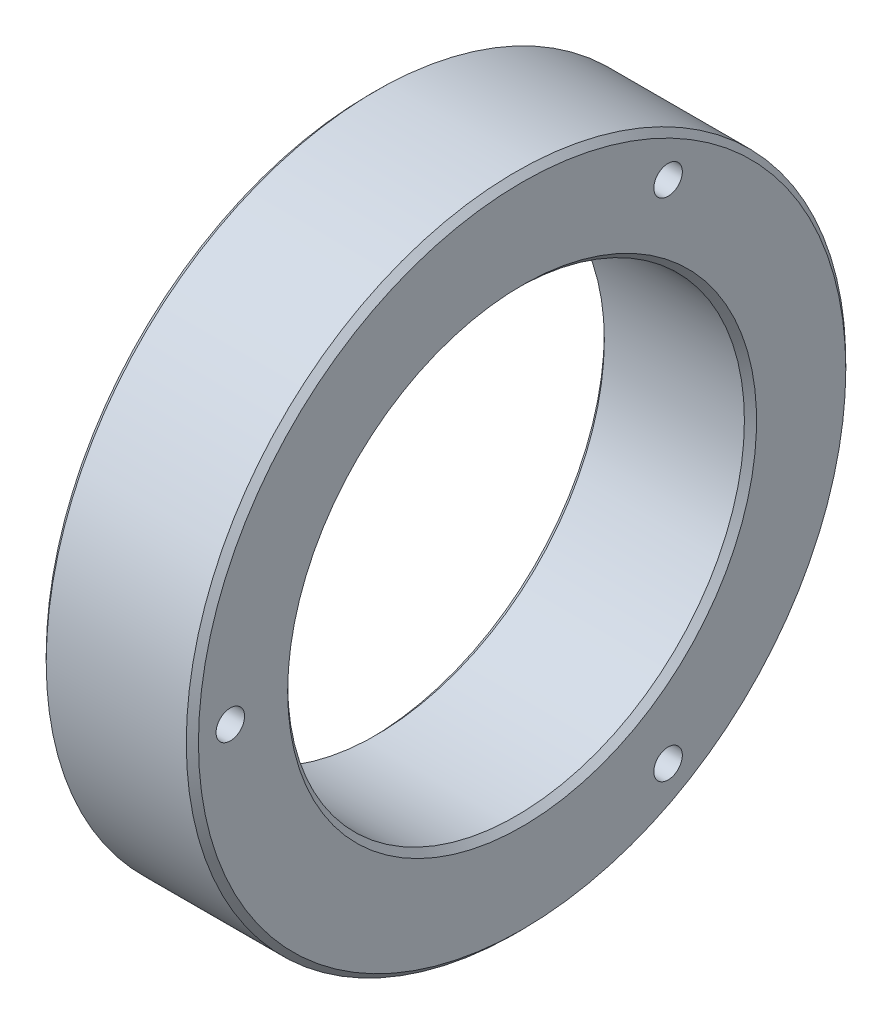
ISO-10303-21;
HEADER;
FILE_DESCRIPTION(('STEP AP214'),'2;1');
FILE_NAME('part.step','',(''),(''),'','','');
FILE_SCHEMA(('AUTOMOTIVE_DESIGN { 1 0 10303 214 1 1 1 1 }'));
ENDSEC;
DATA;
#1=APPLICATION_CONTEXT('core data for automotive mechanical design processes');
#2=APPLICATION_PROTOCOL_DEFINITION('international standard','automotive_design',2000,#1);
#3=PRODUCT_CONTEXT('',#1,'mechanical');
#4=PRODUCT('Part','Part','',(#3));
#5=PRODUCT_RELATED_PRODUCT_CATEGORY('part','',(#4));
#6=PRODUCT_DEFINITION_FORMATION('','',#4);
#7=PRODUCT_DEFINITION_CONTEXT('part definition',#1,'design');
#8=PRODUCT_DEFINITION('design','',#6,#7);
#9=PRODUCT_DEFINITION_SHAPE('','',#8);
#10=(LENGTH_UNIT() NAMED_UNIT(*) SI_UNIT(.MILLI.,.METRE.));
#11=(NAMED_UNIT(*) PLANE_ANGLE_UNIT() SI_UNIT($,.RADIAN.));
#12=(NAMED_UNIT(*) SI_UNIT($,.STERADIAN.) SOLID_ANGLE_UNIT());
#13=UNCERTAINTY_MEASURE_WITH_UNIT(LENGTH_MEASURE(1.E-05),#10,'distance_accuracy_value','');
#14=(GEOMETRIC_REPRESENTATION_CONTEXT(3) GLOBAL_UNCERTAINTY_ASSIGNED_CONTEXT((#13)) GLOBAL_UNIT_ASSIGNED_CONTEXT((#10,
#11,#12)) REPRESENTATION_CONTEXT('',''));
#15=CARTESIAN_POINT('',(0.,0.,0.));
#16=DIRECTION('',(0.,0.,1.));
#17=DIRECTION('',(1.,0.,0.));
#18=AXIS2_PLACEMENT_3D('',#15,#16,#17);
#19=CARTESIAN_POINT('',(0.,57.15,0.));
#20=DIRECTION('',(1.,0.,0.));
#21=DIRECTION('',(0.,0.,-1.));
#22=AXIS2_PLACEMENT_3D('',#19,#20,#21);
#23=PLANE('',#22);
#24=CARTESIAN_POINT('',(0.,69.85,0.));
#25=DIRECTION('',(1.,0.,0.));
#26=DIRECTION('',(0.,0.,-1.));
#27=AXIS2_PLACEMENT_3D('',#24,#25,#26);
#28=CIRCLE('',#27,3.96874999999999);
#29=CARTESIAN_POINT('',(0.,69.85,-3.96874999999999));
#30=VERTEX_POINT('',#29);
#31=EDGE_CURVE('E225',#30,#30,#28,.T.);
#32=ORIENTED_EDGE('',*,*,#31,.T.);
#33=EDGE_LOOP('',(#32));
#34=FACE_BOUND('',#33,.T.);
#35=CARTESIAN_POINT('',(0.,-69.85,0.));
#36=DIRECTION('',(1.,0.,0.));
#37=DIRECTION('',(0.,0.,-1.));
#38=AXIS2_PLACEMENT_3D('',#35,#36,#37);
#39=CIRCLE('',#38,3.96874999999999);
#40=CARTESIAN_POINT('',(0.,-69.85,-3.96874999999999));
#41=VERTEX_POINT('',#40);
#42=EDGE_CURVE('E224',#41,#41,#39,.T.);
#43=ORIENTED_EDGE('',*,*,#42,.T.);
#44=EDGE_LOOP('',(#43));
#45=FACE_BOUND('',#44,.T.);
#46=CARTESIAN_POINT('',(0.,63.246,-36.5252));
#47=DIRECTION('',(1.,0.,0.));
#48=DIRECTION('',(0.,0.,-1.));
#49=AXIS2_PLACEMENT_3D('',#46,#47,#48);
#50=CIRCLE('',#49,5.5626);
#51=CARTESIAN_POINT('',(0.,63.246,-42.0878));
#52=VERTEX_POINT('',#51);
#53=EDGE_CURVE('E233',#52,#52,#50,.T.);
#54=ORIENTED_EDGE('',*,*,#53,.T.);
#55=EDGE_LOOP('',(#54));
#56=FACE_BOUND('',#55,.T.);
#57=CARTESIAN_POINT('',(0.,-63.246,-36.5252));
#58=DIRECTION('',(1.,0.,0.));
#59=DIRECTION('',(0.,0.,-1.));
#60=AXIS2_PLACEMENT_3D('',#57,#58,#59);
#61=CIRCLE('',#60,5.5626);
#62=CARTESIAN_POINT('',(0.,-63.246,-42.0878));
#63=VERTEX_POINT('',#62);
#64=EDGE_CURVE('E75',#63,#63,#61,.T.);
#65=ORIENTED_EDGE('',*,*,#64,.T.);
#66=EDGE_LOOP('',(#65));
#67=FACE_BOUND('',#66,.T.);
#68=CARTESIAN_POINT('',(0.,0.,73.025));
#69=DIRECTION('',(1.,0.,0.));
#70=DIRECTION('',(0.,0.,-1.));
#71=AXIS2_PLACEMENT_3D('',#68,#69,#70);
#72=CIRCLE('',#71,5.5626);
#73=CARTESIAN_POINT('',(0.,0.,67.4624));
#74=VERTEX_POINT('',#73);
#75=EDGE_CURVE('E72',#74,#74,#72,.T.);
#76=ORIENTED_EDGE('',*,*,#75,.T.);
#77=EDGE_LOOP('',(#76));
#78=FACE_BOUND('',#77,.T.);
#79=CARTESIAN_POINT('',(0.,0.,0.));
#80=DIRECTION('',(1.,0.,0.));
#81=DIRECTION('',(0.,0.,-1.));
#82=AXIS2_PLACEMENT_3D('',#79,#80,#81);
#83=CIRCLE('',#82,58.674);
#84=CARTESIAN_POINT('',(0.,0.,-58.674));
#85=VERTEX_POINT('',#84);
#86=EDGE_CURVE('E57',#85,#85,#83,.T.);
#87=ORIENTED_EDGE('',*,*,#86,.T.);
#88=EDGE_LOOP('',(#87));
#89=FACE_BOUND('',#88,.T.);
#90=CARTESIAN_POINT('',(0.,0.,0.));
#91=DIRECTION('',(1.,0.,0.));
#92=DIRECTION('',(0.,0.,-1.));
#93=AXIS2_PLACEMENT_3D('',#90,#91,#92);
#94=CIRCLE('',#93,81.0006);
#95=CARTESIAN_POINT('',(0.,0.,-81.0006));
#96=VERTEX_POINT('',#95);
#97=EDGE_CURVE('E103',#96,#96,#94,.F.);
#98=ORIENTED_EDGE('',*,*,#97,.T.);
#99=EDGE_LOOP('',(#98));
#100=FACE_BOUND('',#99,.T.);
#101=ADVANCED_FACE('F43',(#34,#45,#56,#67,#78,#89,#100),#23,.F.);
#102=CARTESIAN_POINT('',(-25.4,0.,0.));
#103=DIRECTION('',(-1.,0.,0.));
#104=DIRECTION('',(0.,0.,1.));
#105=AXIS2_PLACEMENT_3D('',#102,#103,#104);
#106=CYLINDRICAL_SURFACE('',#105,82.5246);
#107=CARTESIAN_POINT('',(36.576,0.,0.));
#108=DIRECTION('',(-1.,0.,0.));
#109=DIRECTION('',(0.,0.,1.));
#110=AXIS2_PLACEMENT_3D('',#107,#108,#109);
#111=CIRCLE('',#110,82.5246);
#112=CARTESIAN_POINT('',(36.576,0.,82.5246));
#113=VERTEX_POINT('',#112);
#114=EDGE_CURVE('E10',#113,#113,#111,.T.);
#115=ORIENTED_EDGE('',*,*,#114,.T.);
#116=EDGE_LOOP('',(#115));
#117=FACE_BOUND('',#116,.T.);
#118=CARTESIAN_POINT('',(1.524,0.,0.));
#119=DIRECTION('',(1.,0.,0.));
#120=DIRECTION('',(0.,0.,-1.));
#121=AXIS2_PLACEMENT_3D('',#118,#119,#120);
#122=CIRCLE('',#121,82.5246);
#123=CARTESIAN_POINT('',(1.524,0.,-82.5246));
#124=VERTEX_POINT('',#123);
#125=EDGE_CURVE('E52',#124,#124,#122,.T.);
#126=ORIENTED_EDGE('',*,*,#125,.T.);
#127=EDGE_LOOP('',(#126));
#128=FACE_BOUND('',#127,.T.);
#129=ADVANCED_FACE('F130',(#117,#128),#106,.T.);
#130=CARTESIAN_POINT('',(38.1,82.5246,0.));
#131=DIRECTION('',(-1.,0.,0.));
#132=DIRECTION('',(0.,0.,1.));
#133=AXIS2_PLACEMENT_3D('',#130,#131,#132);
#134=PLANE('',#133);
#135=CARTESIAN_POINT('',(38.1,63.246,-36.5252));
#136=DIRECTION('',(1.,0.,0.));
#137=DIRECTION('',(0.,0.,-1.));
#138=AXIS2_PLACEMENT_3D('',#135,#136,#137);
#139=CIRCLE('',#138,3.5687);
#140=CARTESIAN_POINT('',(38.1,63.246,-40.0939));
#141=VERTEX_POINT('',#140);
#142=EDGE_CURVE('E80',#141,#141,#139,.T.);
#143=ORIENTED_EDGE('',*,*,#142,.F.);
#144=EDGE_LOOP('',(#143));
#145=FACE_BOUND('',#144,.T.);
#146=CARTESIAN_POINT('',(38.1,-63.246,-36.5252));
#147=DIRECTION('',(1.,0.,0.));
#148=DIRECTION('',(0.,0.,-1.));
#149=AXIS2_PLACEMENT_3D('',#146,#147,#148);
#150=CIRCLE('',#149,3.5687);
#151=CARTESIAN_POINT('',(38.1,-63.246,-40.0939));
#152=VERTEX_POINT('',#151);
#153=EDGE_CURVE('E67',#152,#152,#150,.T.);
#154=ORIENTED_EDGE('',*,*,#153,.F.);
#155=EDGE_LOOP('',(#154));
#156=FACE_BOUND('',#155,.T.);
#157=CARTESIAN_POINT('',(38.1,0.,73.025));
#158=DIRECTION('',(1.,0.,0.));
#159=DIRECTION('',(0.,0.,-1.));
#160=AXIS2_PLACEMENT_3D('',#157,#158,#159);
#161=CIRCLE('',#160,3.5687);
#162=CARTESIAN_POINT('',(38.1,0.,69.4563));
#163=VERTEX_POINT('',#162);
#164=EDGE_CURVE('E63',#163,#163,#161,.T.);
#165=ORIENTED_EDGE('',*,*,#164,.F.);
#166=EDGE_LOOP('',(#165));
#167=FACE_BOUND('',#166,.T.);
#168=CARTESIAN_POINT('',(38.1,0.,0.));
#169=DIRECTION('',(-1.,0.,0.));
#170=DIRECTION('',(0.,0.,1.));
#171=AXIS2_PLACEMENT_3D('',#168,#169,#170);
#172=CIRCLE('',#171,58.674);
#173=CARTESIAN_POINT('',(38.1,0.,58.674));
#174=VERTEX_POINT('',#173);
#175=EDGE_CURVE('E94',#174,#174,#172,.T.);
#176=ORIENTED_EDGE('',*,*,#175,.T.);
#177=EDGE_LOOP('',(#176));
#178=FACE_BOUND('',#177,.T.);
#179=CARTESIAN_POINT('',(38.1,0.,0.));
#180=DIRECTION('',(-1.,0.,0.));
#181=DIRECTION('',(0.,0.,1.));
#182=AXIS2_PLACEMENT_3D('',#179,#180,#181);
#183=CIRCLE('',#182,81.0006);
#184=CARTESIAN_POINT('',(38.1,0.,81.0006));
#185=VERTEX_POINT('',#184);
#186=EDGE_CURVE('E91',#185,#185,#183,.F.);
#187=ORIENTED_EDGE('',*,*,#186,.T.);
#188=EDGE_LOOP('',(#187));
#189=FACE_BOUND('',#188,.T.);
#190=ADVANCED_FACE('F120',(#145,#156,#167,#178,#189),#134,.F.);
#191=CARTESIAN_POINT('',(-25.4,0.,0.));
#192=DIRECTION('',(-1.,0.,0.));
#193=DIRECTION('',(0.,0.,1.));
#194=AXIS2_PLACEMENT_3D('',#191,#192,#193);
#195=CYLINDRICAL_SURFACE('',#194,57.15);
#196=CARTESIAN_POINT('',(36.576,0.,0.));
#197=DIRECTION('',(-1.,0.,0.));
#198=DIRECTION('',(0.,0.,1.));
#199=AXIS2_PLACEMENT_3D('',#196,#197,#198);
#200=CIRCLE('',#199,57.15);
#201=CARTESIAN_POINT('',(36.576,0.,57.15));
#202=VERTEX_POINT('',#201);
#203=EDGE_CURVE('E100',#202,#202,#200,.F.);
#204=ORIENTED_EDGE('',*,*,#203,.T.);
#205=EDGE_LOOP('',(#204));
#206=FACE_BOUND('',#205,.T.);
#207=CARTESIAN_POINT('',(1.52399999999998,0.,0.));
#208=DIRECTION('',(1.,0.,0.));
#209=DIRECTION('',(0.,0.,-1.));
#210=AXIS2_PLACEMENT_3D('',#207,#208,#209);
#211=CIRCLE('',#210,57.15);
#212=CARTESIAN_POINT('',(1.52399999999998,0.,-57.15));
#213=VERTEX_POINT('',#212);
#214=EDGE_CURVE('E97',#213,#213,#211,.F.);
#215=ORIENTED_EDGE('',*,*,#214,.T.);
#216=EDGE_LOOP('',(#215));
#217=FACE_BOUND('',#216,.T.);
#218=ADVANCED_FACE('F118',(#206,#217),#195,.F.);
#219=CARTESIAN_POINT('',(38.1,0.,0.));
#220=DIRECTION('',(1.,0.,0.));
#221=DIRECTION('',(0.,0.,-1.));
#222=AXIS2_PLACEMENT_3D('',#219,#220,#221);
#223=CONICAL_SURFACE('',#222,58.674,0.785398163397444);
#224=ORIENTED_EDGE('',*,*,#203,.F.);
#225=EDGE_LOOP('',(#224));
#226=FACE_BOUND('',#225,.T.);
#227=ORIENTED_EDGE('',*,*,#175,.F.);
#228=EDGE_LOOP('',(#227));
#229=FACE_BOUND('',#228,.T.);
#230=ADVANCED_FACE('F114',(#226,#229),#223,.F.);
#231=CARTESIAN_POINT('',(1.52399999999998,0.,0.));
#232=DIRECTION('',(-1.,0.,0.));
#233=DIRECTION('',(0.,0.,1.));
#234=AXIS2_PLACEMENT_3D('',#231,#232,#233);
#235=CONICAL_SURFACE('',#234,57.15,0.785398163397455);
#236=ORIENTED_EDGE('',*,*,#86,.F.);
#237=EDGE_LOOP('',(#236));
#238=FACE_BOUND('',#237,.T.);
#239=ORIENTED_EDGE('',*,*,#214,.F.);
#240=EDGE_LOOP('',(#239));
#241=FACE_BOUND('',#240,.T.);
#242=ADVANCED_FACE('F110',(#238,#241),#235,.F.);
#243=CARTESIAN_POINT('',(36.576,0.,0.));
#244=DIRECTION('',(-1.,0.,0.));
#245=DIRECTION('',(0.,0.,1.));
#246=AXIS2_PLACEMENT_3D('',#243,#244,#245);
#247=CONICAL_SURFACE('',#246,82.5246,0.785398163397451);
#248=ORIENTED_EDGE('',*,*,#186,.F.);
#249=EDGE_LOOP('',(#248));
#250=FACE_BOUND('',#249,.T.);
#251=ORIENTED_EDGE('',*,*,#114,.F.);
#252=EDGE_LOOP('',(#251));
#253=FACE_BOUND('',#252,.T.);
#254=ADVANCED_FACE('F113',(#250,#253),#247,.T.);
#255=CARTESIAN_POINT('',(0.,0.,0.));
#256=DIRECTION('',(1.,0.,0.));
#257=DIRECTION('',(0.,0.,-1.));
#258=AXIS2_PLACEMENT_3D('',#255,#256,#257);
#259=CONICAL_SURFACE('',#258,81.0006,0.785398163397448);
#260=ORIENTED_EDGE('',*,*,#125,.F.);
#261=EDGE_LOOP('',(#260));
#262=FACE_BOUND('',#261,.T.);
#263=ORIENTED_EDGE('',*,*,#97,.F.);
#264=EDGE_LOOP('',(#263));
#265=FACE_BOUND('',#264,.T.);
#266=ADVANCED_FACE('F46',(#262,#265),#259,.T.);
#267=CARTESIAN_POINT('',(38.1,0.,73.025));
#268=DIRECTION('',(-1.,0.,0.));
#269=DIRECTION('',(0.,0.,1.));
#270=AXIS2_PLACEMENT_3D('',#267,#268,#269);
#271=CYLINDRICAL_SURFACE('',#270,3.5687);
#272=CARTESIAN_POINT('',(7.112,0.,73.025));
#273=DIRECTION('',(1.,0.,0.));
#274=DIRECTION('',(0.,0.,-1.));
#275=AXIS2_PLACEMENT_3D('',#272,#273,#274);
#276=CIRCLE('',#275,3.5687);
#277=CARTESIAN_POINT('',(7.112,0.,69.4563));
#278=VERTEX_POINT('',#277);
#279=EDGE_CURVE('E61',#278,#278,#276,.T.);
#280=ORIENTED_EDGE('',*,*,#279,.F.);
#281=EDGE_LOOP('',(#280));
#282=FACE_BOUND('',#281,.T.);
#283=ORIENTED_EDGE('',*,*,#164,.T.);
#284=EDGE_LOOP('',(#283));
#285=FACE_BOUND('',#284,.T.);
#286=ADVANCED_FACE('F158',(#282,#285),#271,.F.);
#287=CARTESIAN_POINT('',(7.112,0.,73.025));
#288=DIRECTION('',(-1.,0.,0.));
#289=DIRECTION('',(0.,0.,1.));
#290=AXIS2_PLACEMENT_3D('',#287,#288,#289);
#291=CYLINDRICAL_SURFACE('',#290,5.5626);
#292=CARTESIAN_POINT('',(7.112,0.,73.025));
#293=DIRECTION('',(1.,0.,0.));
#294=DIRECTION('',(0.,0.,-1.));
#295=AXIS2_PLACEMENT_3D('',#292,#293,#294);
#296=CIRCLE('',#295,5.5626);
#297=CARTESIAN_POINT('',(7.112,0.,67.4624));
#298=VERTEX_POINT('',#297);
#299=EDGE_CURVE('E64',#298,#298,#296,.T.);
#300=ORIENTED_EDGE('',*,*,#299,.T.);
#301=EDGE_LOOP('',(#300));
#302=FACE_BOUND('',#301,.T.);
#303=ORIENTED_EDGE('',*,*,#75,.F.);
#304=EDGE_LOOP('',(#303));
#305=FACE_BOUND('',#304,.T.);
#306=ADVANCED_FACE('F166',(#302,#305),#291,.F.);
#307=CARTESIAN_POINT('',(7.112,0.,73.025));
#308=DIRECTION('',(1.,0.,0.));
#309=DIRECTION('',(0.,0.,-1.));
#310=AXIS2_PLACEMENT_3D('',#307,#308,#309);
#311=PLANE('',#310);
#312=ORIENTED_EDGE('',*,*,#279,.T.);
#313=EDGE_LOOP('',(#312));
#314=FACE_BOUND('',#313,.T.);
#315=ORIENTED_EDGE('',*,*,#299,.F.);
#316=EDGE_LOOP('',(#315));
#317=FACE_BOUND('',#316,.T.);
#318=ADVANCED_FACE('F175',(#314,#317),#311,.F.);
#319=CARTESIAN_POINT('',(38.1,-63.246,-36.5252));
#320=DIRECTION('',(-1.,0.,0.));
#321=DIRECTION('',(0.,0.,1.));
#322=AXIS2_PLACEMENT_3D('',#319,#320,#321);
#323=CYLINDRICAL_SURFACE('',#322,3.5687);
#324=CARTESIAN_POINT('',(7.112,-63.246,-36.5252));
#325=DIRECTION('',(1.,0.,0.));
#326=DIRECTION('',(0.,0.,-1.));
#327=AXIS2_PLACEMENT_3D('',#324,#325,#326);
#328=CIRCLE('',#327,3.5687);
#329=CARTESIAN_POINT('',(7.112,-63.246,-40.0939));
#330=VERTEX_POINT('',#329);
#331=EDGE_CURVE('E65',#330,#330,#328,.T.);
#332=ORIENTED_EDGE('',*,*,#331,.F.);
#333=EDGE_LOOP('',(#332));
#334=FACE_BOUND('',#333,.T.);
#335=ORIENTED_EDGE('',*,*,#153,.T.);
#336=EDGE_LOOP('',(#335));
#337=FACE_BOUND('',#336,.T.);
#338=ADVANCED_FACE('F183',(#334,#337),#323,.F.);
#339=CARTESIAN_POINT('',(7.112,-63.246,-36.5252));
#340=DIRECTION('',(-1.,0.,0.));
#341=DIRECTION('',(0.,0.,1.));
#342=AXIS2_PLACEMENT_3D('',#339,#340,#341);
#343=CYLINDRICAL_SURFACE('',#342,5.5626);
#344=CARTESIAN_POINT('',(7.112,-63.246,-36.5252));
#345=DIRECTION('',(1.,0.,0.));
#346=DIRECTION('',(0.,0.,-1.));
#347=AXIS2_PLACEMENT_3D('',#344,#345,#346);
#348=CIRCLE('',#347,5.5626);
#349=CARTESIAN_POINT('',(7.112,-63.246,-42.0878));
#350=VERTEX_POINT('',#349);
#351=EDGE_CURVE('E68',#350,#350,#348,.T.);
#352=ORIENTED_EDGE('',*,*,#351,.T.);
#353=EDGE_LOOP('',(#352));
#354=FACE_BOUND('',#353,.T.);
#355=ORIENTED_EDGE('',*,*,#64,.F.);
#356=EDGE_LOOP('',(#355));
#357=FACE_BOUND('',#356,.T.);
#358=ADVANCED_FACE('F187',(#354,#357),#343,.F.);
#359=CARTESIAN_POINT('',(7.112,-63.246,-36.5252));
#360=DIRECTION('',(1.,0.,0.));
#361=DIRECTION('',(0.,0.,-1.));
#362=AXIS2_PLACEMENT_3D('',#359,#360,#361);
#363=PLANE('',#362);
#364=ORIENTED_EDGE('',*,*,#331,.T.);
#365=EDGE_LOOP('',(#364));
#366=FACE_BOUND('',#365,.T.);
#367=ORIENTED_EDGE('',*,*,#351,.F.);
#368=EDGE_LOOP('',(#367));
#369=FACE_BOUND('',#368,.T.);
#370=ADVANCED_FACE('F191',(#366,#369),#363,.F.);
#371=CARTESIAN_POINT('',(38.1,63.246,-36.5252));
#372=DIRECTION('',(-1.,0.,0.));
#373=DIRECTION('',(0.,0.,1.));
#374=AXIS2_PLACEMENT_3D('',#371,#372,#373);
#375=CYLINDRICAL_SURFACE('',#374,3.5687);
#376=CARTESIAN_POINT('',(7.112,63.246,-36.5252));
#377=DIRECTION('',(1.,0.,0.));
#378=DIRECTION('',(0.,0.,-1.));
#379=AXIS2_PLACEMENT_3D('',#376,#377,#378);
#380=CIRCLE('',#379,3.5687);
#381=CARTESIAN_POINT('',(7.112,63.246,-40.0939));
#382=VERTEX_POINT('',#381);
#383=EDGE_CURVE('E48',#382,#382,#380,.T.);
#384=ORIENTED_EDGE('',*,*,#383,.F.);
#385=EDGE_LOOP('',(#384));
#386=FACE_BOUND('',#385,.T.);
#387=ORIENTED_EDGE('',*,*,#142,.T.);
#388=EDGE_LOOP('',(#387));
#389=FACE_BOUND('',#388,.T.);
#390=ADVANCED_FACE('F194',(#386,#389),#375,.F.);
#391=CARTESIAN_POINT('',(7.112,63.246,-36.5252));
#392=DIRECTION('',(-1.,0.,0.));
#393=DIRECTION('',(0.,0.,1.));
#394=AXIS2_PLACEMENT_3D('',#391,#392,#393);
#395=CYLINDRICAL_SURFACE('',#394,5.5626);
#396=CARTESIAN_POINT('',(7.112,63.246,-36.5252));
#397=DIRECTION('',(1.,0.,0.));
#398=DIRECTION('',(0.,0.,-1.));
#399=AXIS2_PLACEMENT_3D('',#396,#397,#398);
#400=CIRCLE('',#399,5.5626);
#401=CARTESIAN_POINT('',(7.112,63.246,-42.0878));
#402=VERTEX_POINT('',#401);
#403=EDGE_CURVE('E235',#402,#402,#400,.T.);
#404=ORIENTED_EDGE('',*,*,#403,.T.);
#405=EDGE_LOOP('',(#404));
#406=FACE_BOUND('',#405,.T.);
#407=ORIENTED_EDGE('',*,*,#53,.F.);
#408=EDGE_LOOP('',(#407));
#409=FACE_BOUND('',#408,.T.);
#410=ADVANCED_FACE('F197',(#406,#409),#395,.F.);
#411=CARTESIAN_POINT('',(7.112,63.246,-36.5252));
#412=DIRECTION('',(1.,0.,0.));
#413=DIRECTION('',(0.,0.,-1.));
#414=AXIS2_PLACEMENT_3D('',#411,#412,#413);
#415=PLANE('',#414);
#416=ORIENTED_EDGE('',*,*,#383,.T.);
#417=EDGE_LOOP('',(#416));
#418=FACE_BOUND('',#417,.T.);
#419=ORIENTED_EDGE('',*,*,#403,.F.);
#420=EDGE_LOOP('',(#419));
#421=FACE_BOUND('',#420,.T.);
#422=ADVANCED_FACE('F201',(#418,#421),#415,.F.);
#423=CARTESIAN_POINT('',(25.4,-69.85,0.));
#424=DIRECTION('',(-1.,0.,0.));
#425=DIRECTION('',(0.,0.,1.));
#426=AXIS2_PLACEMENT_3D('',#423,#424,#425);
#427=CYLINDRICAL_SURFACE('',#426,3.96874999999999);
#428=CARTESIAN_POINT('',(25.4,-69.85,0.));
#429=DIRECTION('',(1.,0.,0.));
#430=DIRECTION('',(0.,0.,-1.));
#431=AXIS2_PLACEMENT_3D('',#428,#429,#430);
#432=CIRCLE('',#431,3.96874999999999);
#433=CARTESIAN_POINT('',(25.4,-69.85,-3.96874999999999));
#434=VERTEX_POINT('',#433);
#435=EDGE_CURVE('E228',#434,#434,#432,.T.);
#436=ORIENTED_EDGE('',*,*,#435,.T.);
#437=EDGE_LOOP('',(#436));
#438=FACE_BOUND('',#437,.T.);
#439=ORIENTED_EDGE('',*,*,#42,.F.);
#440=EDGE_LOOP('',(#439));
#441=FACE_BOUND('',#440,.T.);
#442=ADVANCED_FACE('F205',(#438,#441),#427,.F.);
#443=CARTESIAN_POINT('',(25.4,-69.85,0.));
#444=DIRECTION('',(1.,0.,0.));
#445=DIRECTION('',(0.,0.,-1.));
#446=AXIS2_PLACEMENT_3D('',#443,#444,#445);
#447=PLANE('',#446);
#448=ORIENTED_EDGE('',*,*,#435,.F.);
#449=EDGE_LOOP('',(#448));
#450=FACE_BOUND('',#449,.T.);
#451=ADVANCED_FACE('F209',(#450),#447,.F.);
#452=CARTESIAN_POINT('',(25.4,69.85,0.));
#453=DIRECTION('',(-1.,0.,0.));
#454=DIRECTION('',(0.,0.,1.));
#455=AXIS2_PLACEMENT_3D('',#452,#453,#454);
#456=CYLINDRICAL_SURFACE('',#455,3.96874999999999);
#457=CARTESIAN_POINT('',(25.4,69.85,0.));
#458=DIRECTION('',(1.,0.,0.));
#459=DIRECTION('',(0.,0.,-1.));
#460=AXIS2_PLACEMENT_3D('',#457,#458,#459);
#461=CIRCLE('',#460,3.96874999999999);
#462=CARTESIAN_POINT('',(25.4,69.85,-3.96874999999999));
#463=VERTEX_POINT('',#462);
#464=EDGE_CURVE('E223',#463,#463,#461,.T.);
#465=ORIENTED_EDGE('',*,*,#464,.T.);
#466=EDGE_LOOP('',(#465));
#467=FACE_BOUND('',#466,.T.);
#468=ORIENTED_EDGE('',*,*,#31,.F.);
#469=EDGE_LOOP('',(#468));
#470=FACE_BOUND('',#469,.T.);
#471=ADVANCED_FACE('F212',(#467,#470),#456,.F.);
#472=CARTESIAN_POINT('',(25.4,69.85,0.));
#473=DIRECTION('',(1.,0.,0.));
#474=DIRECTION('',(0.,0.,-1.));
#475=AXIS2_PLACEMENT_3D('',#472,#473,#474);
#476=PLANE('',#475);
#477=ORIENTED_EDGE('',*,*,#464,.F.);
#478=EDGE_LOOP('',(#477));
#479=FACE_BOUND('',#478,.T.);
#480=ADVANCED_FACE('F215',(#479),#476,.F.);
#481=CLOSED_SHELL('',(#101,#129,#190,#218,#230,#242,#254,#266,#286,#306,#318,#338,#358,#370,
#390,#410,#422,#442,#451,#471,#480));
#482=MANIFOLD_SOLID_BREP('B2',#481);
#483=ADVANCED_BREP_SHAPE_REPRESENTATION('',(#18,#482),#14);
#484=SHAPE_DEFINITION_REPRESENTATION(#9,#483);
ENDSEC;
END-ISO-10303-21;
